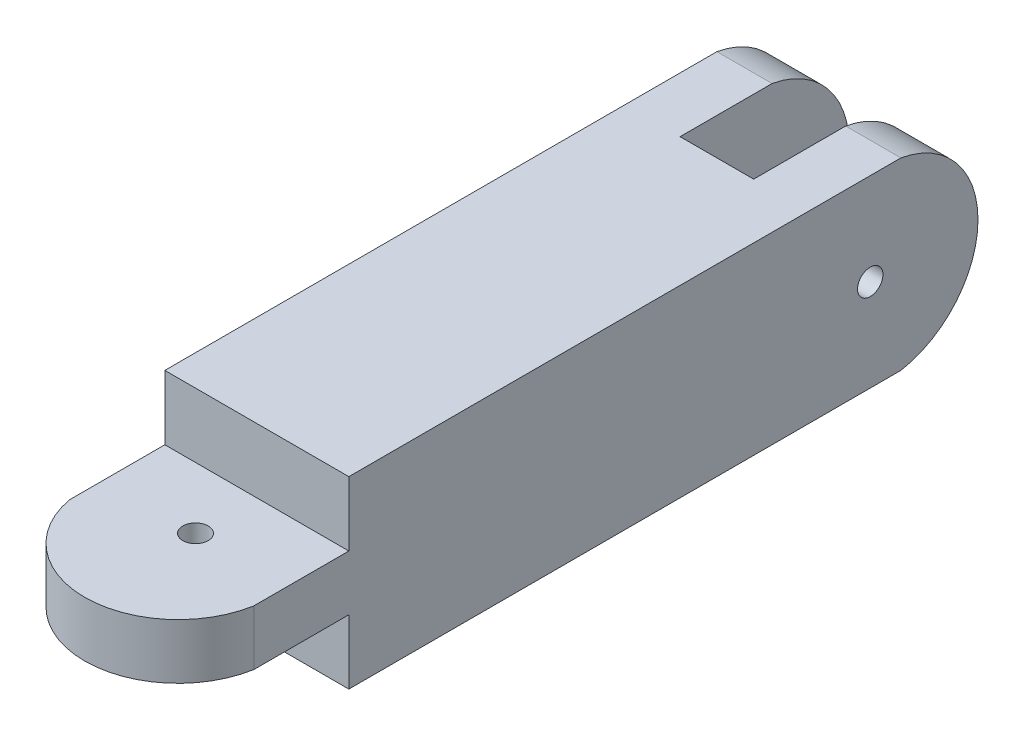
ISO-10303-21;
HEADER;
FILE_DESCRIPTION(('STEP AP214'),'2;1');
FILE_NAME('part.step','',(''),(''),'','','');
FILE_SCHEMA(('AUTOMOTIVE_DESIGN { 1 0 10303 214 1 1 1 1 }'));
ENDSEC;
DATA;
#1=APPLICATION_CONTEXT('core data for automotive mechanical design processes');
#2=APPLICATION_PROTOCOL_DEFINITION('international standard','automotive_design',2000,#1);
#3=PRODUCT_CONTEXT('',#1,'mechanical');
#4=PRODUCT('Part','Part','',(#3));
#5=PRODUCT_RELATED_PRODUCT_CATEGORY('part','',(#4));
#6=PRODUCT_DEFINITION_FORMATION('','',#4);
#7=PRODUCT_DEFINITION_CONTEXT('part definition',#1,'design');
#8=PRODUCT_DEFINITION('design','',#6,#7);
#9=PRODUCT_DEFINITION_SHAPE('','',#8);
#10=(LENGTH_UNIT() NAMED_UNIT(*) SI_UNIT(.MILLI.,.METRE.));
#11=(NAMED_UNIT(*) PLANE_ANGLE_UNIT() SI_UNIT($,.RADIAN.));
#12=(NAMED_UNIT(*) SI_UNIT($,.STERADIAN.) SOLID_ANGLE_UNIT());
#13=UNCERTAINTY_MEASURE_WITH_UNIT(LENGTH_MEASURE(1.E-05),#10,'distance_accuracy_value','');
#14=(GEOMETRIC_REPRESENTATION_CONTEXT(3) GLOBAL_UNCERTAINTY_ASSIGNED_CONTEXT((#13)) GLOBAL_UNIT_ASSIGNED_CONTEXT((#10,
#11,#12)) REPRESENTATION_CONTEXT('',''));
#15=CARTESIAN_POINT('',(0.,0.,0.));
#16=DIRECTION('',(0.,0.,1.));
#17=DIRECTION('',(1.,0.,0.));
#18=AXIS2_PLACEMENT_3D('',#15,#16,#17);
#19=CARTESIAN_POINT('',(0.,0.,150.));
#20=DIRECTION('',(0.,0.,1.));
#21=DIRECTION('',(1.,0.,0.));
#22=AXIS2_PLACEMENT_3D('',#19,#20,#21);
#23=PLANE('',#22);
#24=DIRECTION('',(1.,0.,0.));
#25=VECTOR('',#24,1.);
#26=CARTESIAN_POINT('',(-30.,-9.,150.));
#27=LINE('',#26,#25);
#28=CARTESIAN_POINT('',(-30.,-9.,150.));
#29=VERTEX_POINT('',#28);
#30=CARTESIAN_POINT('',(30.,-9.,150.));
#31=VERTEX_POINT('',#30);
#32=EDGE_CURVE('E55',#29,#31,#27,.T.);
#33=ORIENTED_EDGE('',*,*,#32,.F.);
#34=DIRECTION('',(0.,-1.,0.));
#35=VECTOR('',#34,1.);
#36=CARTESIAN_POINT('',(-30.,30.,150.));
#37=LINE('',#36,#35);
#38=CARTESIAN_POINT('',(-30.,-30.,150.));
#39=VERTEX_POINT('',#38);
#40=EDGE_CURVE('E309',#29,#39,#37,.T.);
#41=ORIENTED_EDGE('',*,*,#40,.T.);
#42=DIRECTION('',(1.,0.,0.));
#43=VECTOR('',#42,1.);
#44=CARTESIAN_POINT('',(-30.,-30.,150.));
#45=LINE('',#44,#43);
#46=CARTESIAN_POINT('',(30.,-30.,150.));
#47=VERTEX_POINT('',#46);
#48=EDGE_CURVE('E313',#39,#47,#45,.T.);
#49=ORIENTED_EDGE('',*,*,#48,.T.);
#50=DIRECTION('',(0.,1.,0.));
#51=VECTOR('',#50,1.);
#52=CARTESIAN_POINT('',(30.,30.,150.));
#53=LINE('',#52,#51);
#54=EDGE_CURVE('E302',#47,#31,#53,.T.);
#55=ORIENTED_EDGE('',*,*,#54,.T.);
#56=EDGE_LOOP('',(#33,#41,#49,#55));
#57=FACE_BOUND('',#56,.T.);
#58=ADVANCED_FACE('F39',(#57),#23,.T.);
#59=CARTESIAN_POINT('',(0.,0.,0.));
#60=DIRECTION('',(0.,0.,1.));
#61=DIRECTION('',(1.,0.,0.));
#62=AXIS2_PLACEMENT_3D('',#59,#60,#61);
#63=PLANE('',#62);
#64=DIRECTION('',(0.,1.,0.));
#65=VECTOR('',#64,1.);
#66=CARTESIAN_POINT('',(12.,30.,0.));
#67=LINE('',#66,#65);
#68=CARTESIAN_POINT('',(12.,-30.,0.));
#69=VERTEX_POINT('',#68);
#70=CARTESIAN_POINT('',(12.,30.,0.));
#71=VERTEX_POINT('',#70);
#72=EDGE_CURVE('E260',#69,#71,#67,.T.);
#73=ORIENTED_EDGE('',*,*,#72,.F.);
#74=DIRECTION('',(1.,0.,0.));
#75=VECTOR('',#74,1.);
#76=CARTESIAN_POINT('',(-30.,-30.,0.));
#77=LINE('',#76,#75);
#78=CARTESIAN_POINT('',(-12.,-30.,0.));
#79=VERTEX_POINT('',#78);
#80=EDGE_CURVE('E319',#79,#69,#77,.T.);
#81=ORIENTED_EDGE('',*,*,#80,.F.);
#82=DIRECTION('',(0.,-1.,0.));
#83=VECTOR('',#82,1.);
#84=CARTESIAN_POINT('',(-12.,-30.,0.));
#85=LINE('',#84,#83);
#86=CARTESIAN_POINT('',(-12.,30.,0.));
#87=VERTEX_POINT('',#86);
#88=EDGE_CURVE('E281',#87,#79,#85,.T.);
#89=ORIENTED_EDGE('',*,*,#88,.F.);
#90=DIRECTION('',(-1.,0.,0.));
#91=VECTOR('',#90,1.);
#92=CARTESIAN_POINT('',(-30.,30.,0.));
#93=LINE('',#92,#91);
#94=EDGE_CURVE('E301',#71,#87,#93,.T.);
#95=ORIENTED_EDGE('',*,*,#94,.F.);
#96=EDGE_LOOP('',(#73,#81,#89,#95));
#97=FACE_BOUND('',#96,.T.);
#98=ADVANCED_FACE('F374',(#97),#63,.F.);
#99=CARTESIAN_POINT('',(30.,30.,150.));
#100=DIRECTION('',(-1.,0.,0.));
#101=DIRECTION('',(0.,-1.,0.));
#102=AXIS2_PLACEMENT_3D('',#99,#100,#101);
#103=PLANE('',#102);
#104=CARTESIAN_POINT('',(30.,0.,-20.));
#105=DIRECTION('',(-1.,0.,0.));
#106=DIRECTION('',(0.,-1.,0.));
#107=AXIS2_PLACEMENT_3D('',#104,#105,#106);
#108=CIRCLE('',#107,4.15);
#109=CARTESIAN_POINT('',(30.,-4.15,-20.));
#110=VERTEX_POINT('',#109);
#111=EDGE_CURVE('E407',#110,#110,#108,.T.);
#112=ORIENTED_EDGE('',*,*,#111,.T.);
#113=EDGE_LOOP('',(#112));
#114=FACE_BOUND('',#113,.T.);
#115=DIRECTION('',(0.,0.,-1.));
#116=VECTOR('',#115,1.);
#117=CARTESIAN_POINT('',(30.,-30.,150.));
#118=LINE('',#117,#116);
#119=CARTESIAN_POINT('',(30.,-30.,-30.));
#120=VERTEX_POINT('',#119);
#121=EDGE_CURVE('E316',#47,#120,#118,.T.);
#122=ORIENTED_EDGE('',*,*,#121,.T.);
#123=CARTESIAN_POINT('',(30.,0.,-24.6688744152853));
#124=DIRECTION('',(1.,0.,0.));
#125=DIRECTION('',(0.,-1.,0.));
#126=AXIS2_PLACEMENT_3D('',#123,#124,#125);
#127=CIRCLE('',#126,30.47);
#128=CARTESIAN_POINT('',(30.,30.,-30.));
#129=VERTEX_POINT('',#128);
#130=EDGE_CURVE('E252',#120,#129,#127,.T.);
#131=ORIENTED_EDGE('',*,*,#130,.T.);
#132=DIRECTION('',(0.,0.,-1.));
#133=VECTOR('',#132,1.);
#134=CARTESIAN_POINT('',(30.,30.,150.));
#135=LINE('',#134,#133);
#136=CARTESIAN_POINT('',(30.,30.,150.));
#137=VERTEX_POINT('',#136);
#138=EDGE_CURVE('E11',#137,#129,#135,.T.);
#139=ORIENTED_EDGE('',*,*,#138,.F.);
#140=CARTESIAN_POINT('',(30.,9.,150.));
#141=VERTEX_POINT('',#140);
#142=EDGE_CURVE('E306',#141,#137,#53,.T.);
#143=ORIENTED_EDGE('',*,*,#142,.F.);
#144=DIRECTION('',(0.,0.,-1.));
#145=VECTOR('',#144,1.);
#146=CARTESIAN_POINT('',(30.,9.,181.));
#147=LINE('',#146,#145);
#148=CARTESIAN_POINT('',(30.,9.,181.));
#149=VERTEX_POINT('',#148);
#150=EDGE_CURVE('E243',#149,#141,#147,.T.);
#151=ORIENTED_EDGE('',*,*,#150,.F.);
#152=DIRECTION('',(0.,1.,0.));
#153=VECTOR('',#152,1.);
#154=CARTESIAN_POINT('',(30.,9.,181.));
#155=LINE('',#154,#153);
#156=CARTESIAN_POINT('',(30.,-9.,181.));
#157=VERTEX_POINT('',#156);
#158=EDGE_CURVE('E219',#157,#149,#155,.T.);
#159=ORIENTED_EDGE('',*,*,#158,.F.);
#160=DIRECTION('',(0.,0.,-1.));
#161=VECTOR('',#160,1.);
#162=CARTESIAN_POINT('',(30.,-9.,181.));
#163=LINE('',#162,#161);
#164=EDGE_CURVE('E227',#157,#31,#163,.T.);
#165=ORIENTED_EDGE('',*,*,#164,.T.);
#166=ORIENTED_EDGE('',*,*,#54,.F.);
#167=EDGE_LOOP('',(#122,#131,#139,#143,#151,#159,#165,#166));
#168=FACE_BOUND('',#167,.T.);
#169=ADVANCED_FACE('F41',(#114,#168),#103,.F.);
#170=CARTESIAN_POINT('',(-30.,30.,150.));
#171=DIRECTION('',(0.,-1.,0.));
#172=DIRECTION('',(0.,0.,-1.));
#173=AXIS2_PLACEMENT_3D('',#170,#171,#172);
#174=PLANE('',#173);
#175=ORIENTED_EDGE('',*,*,#138,.T.);
#176=DIRECTION('',(1.,0.,0.));
#177=VECTOR('',#176,1.);
#178=CARTESIAN_POINT('',(30.,30.,-30.));
#179=LINE('',#178,#177);
#180=CARTESIAN_POINT('',(12.,30.,-30.));
#181=VERTEX_POINT('',#180);
#182=EDGE_CURVE('E268',#181,#129,#179,.T.);
#183=ORIENTED_EDGE('',*,*,#182,.F.);
#184=DIRECTION('',(0.,0.,1.));
#185=VECTOR('',#184,1.);
#186=CARTESIAN_POINT('',(12.,30.,-30.));
#187=LINE('',#186,#185);
#188=EDGE_CURVE('E272',#181,#71,#187,.T.);
#189=ORIENTED_EDGE('',*,*,#188,.T.);
#190=ORIENTED_EDGE('',*,*,#94,.T.);
#191=DIRECTION('',(0.,0.,1.));
#192=VECTOR('',#191,1.);
#193=CARTESIAN_POINT('',(-12.,30.,-30.));
#194=LINE('',#193,#192);
#195=CARTESIAN_POINT('',(-12.,30.,-30.));
#196=VERTEX_POINT('',#195);
#197=EDGE_CURVE('E297',#196,#87,#194,.T.);
#198=ORIENTED_EDGE('',*,*,#197,.F.);
#199=DIRECTION('',(1.,0.,0.));
#200=VECTOR('',#199,1.);
#201=CARTESIAN_POINT('',(-30.,30.,-30.));
#202=LINE('',#201,#200);
#203=CARTESIAN_POINT('',(-30.,30.,-30.));
#204=VERTEX_POINT('',#203);
#205=EDGE_CURVE('E282',#204,#196,#202,.T.);
#206=ORIENTED_EDGE('',*,*,#205,.F.);
#207=DIRECTION('',(0.,0.,-1.));
#208=VECTOR('',#207,1.);
#209=CARTESIAN_POINT('',(-30.,30.,150.));
#210=LINE('',#209,#208);
#211=CARTESIAN_POINT('',(-30.,30.,150.));
#212=VERTEX_POINT('',#211);
#213=EDGE_CURVE('E48',#212,#204,#210,.T.);
#214=ORIENTED_EDGE('',*,*,#213,.F.);
#215=DIRECTION('',(-1.,0.,0.));
#216=VECTOR('',#215,1.);
#217=CARTESIAN_POINT('',(-30.,30.,150.));
#218=LINE('',#217,#216);
#219=EDGE_CURVE('E305',#137,#212,#218,.T.);
#220=ORIENTED_EDGE('',*,*,#219,.F.);
#221=EDGE_LOOP('',(#175,#183,#189,#190,#198,#206,#214,#220));
#222=FACE_BOUND('',#221,.T.);
#223=ADVANCED_FACE('F361',(#222),#174,.F.);
#224=CARTESIAN_POINT('',(-30.,30.,150.));
#225=DIRECTION('',(1.,0.,0.));
#226=DIRECTION('',(0.,1.,0.));
#227=AXIS2_PLACEMENT_3D('',#224,#225,#226);
#228=PLANE('',#227);
#229=CARTESIAN_POINT('',(-30.,0.,-20.));
#230=DIRECTION('',(1.,0.,0.));
#231=DIRECTION('',(0.,1.,0.));
#232=AXIS2_PLACEMENT_3D('',#229,#230,#231);
#233=CIRCLE('',#232,4.15);
#234=CARTESIAN_POINT('',(-30.,4.15,-20.));
#235=VERTEX_POINT('',#234);
#236=EDGE_CURVE('E416',#235,#235,#233,.T.);
#237=ORIENTED_EDGE('',*,*,#236,.T.);
#238=EDGE_LOOP('',(#237));
#239=FACE_BOUND('',#238,.T.);
#240=ORIENTED_EDGE('',*,*,#213,.T.);
#241=CARTESIAN_POINT('',(-30.,0.,-24.6688744152853));
#242=DIRECTION('',(-1.,0.,0.));
#243=DIRECTION('',(0.,1.,0.));
#244=AXIS2_PLACEMENT_3D('',#241,#242,#243);
#245=CIRCLE('',#244,30.47);
#246=CARTESIAN_POINT('',(-30.,-30.,-30.));
#247=VERTEX_POINT('',#246);
#248=EDGE_CURVE('E247',#204,#247,#245,.T.);
#249=ORIENTED_EDGE('',*,*,#248,.T.);
#250=DIRECTION('',(0.,0.,-1.));
#251=VECTOR('',#250,1.);
#252=CARTESIAN_POINT('',(-30.,-30.,150.));
#253=LINE('',#252,#251);
#254=EDGE_CURVE('E326',#39,#247,#253,.T.);
#255=ORIENTED_EDGE('',*,*,#254,.F.);
#256=ORIENTED_EDGE('',*,*,#40,.F.);
#257=DIRECTION('',(0.,0.,-1.));
#258=VECTOR('',#257,1.);
#259=CARTESIAN_POINT('',(-30.,-9.,181.));
#260=LINE('',#259,#258);
#261=CARTESIAN_POINT('',(-30.,-9.,181.));
#262=VERTEX_POINT('',#261);
#263=EDGE_CURVE('E235',#262,#29,#260,.T.);
#264=ORIENTED_EDGE('',*,*,#263,.F.);
#265=DIRECTION('',(0.,-1.,0.));
#266=VECTOR('',#265,1.);
#267=CARTESIAN_POINT('',(-30.,9.,181.));
#268=LINE('',#267,#266);
#269=CARTESIAN_POINT('',(-30.,9.,181.));
#270=VERTEX_POINT('',#269);
#271=EDGE_CURVE('E223',#270,#262,#268,.T.);
#272=ORIENTED_EDGE('',*,*,#271,.F.);
#273=DIRECTION('',(0.,0.,-1.));
#274=VECTOR('',#273,1.);
#275=CARTESIAN_POINT('',(-30.,9.,181.));
#276=LINE('',#275,#274);
#277=CARTESIAN_POINT('',(-30.,9.,150.));
#278=VERTEX_POINT('',#277);
#279=EDGE_CURVE('E239',#270,#278,#276,.T.);
#280=ORIENTED_EDGE('',*,*,#279,.T.);
#281=EDGE_CURVE('E310',#212,#278,#37,.T.);
#282=ORIENTED_EDGE('',*,*,#281,.F.);
#283=EDGE_LOOP('',(#240,#249,#255,#256,#264,#272,#280,#282));
#284=FACE_BOUND('',#283,.T.);
#285=ADVANCED_FACE('F334',(#239,#284),#228,.F.);
#286=CARTESIAN_POINT('',(-30.,-30.,150.));
#287=DIRECTION('',(0.,1.,0.));
#288=DIRECTION('',(0.,0.,1.));
#289=AXIS2_PLACEMENT_3D('',#286,#287,#288);
#290=PLANE('',#289);
#291=ORIENTED_EDGE('',*,*,#254,.T.);
#292=DIRECTION('',(-1.,0.,0.));
#293=VECTOR('',#292,1.);
#294=CARTESIAN_POINT('',(-30.,-30.,-30.));
#295=LINE('',#294,#293);
#296=CARTESIAN_POINT('',(-12.,-30.,-30.));
#297=VERTEX_POINT('',#296);
#298=EDGE_CURVE('E286',#297,#247,#295,.T.);
#299=ORIENTED_EDGE('',*,*,#298,.F.);
#300=DIRECTION('',(0.,0.,1.));
#301=VECTOR('',#300,1.);
#302=CARTESIAN_POINT('',(-12.,-30.,-30.));
#303=LINE('',#302,#301);
#304=EDGE_CURVE('E290',#297,#79,#303,.T.);
#305=ORIENTED_EDGE('',*,*,#304,.T.);
#306=ORIENTED_EDGE('',*,*,#80,.T.);
#307=DIRECTION('',(0.,0.,1.));
#308=VECTOR('',#307,1.);
#309=CARTESIAN_POINT('',(12.,-30.,-30.));
#310=LINE('',#309,#308);
#311=CARTESIAN_POINT('',(12.,-30.,-30.));
#312=VERTEX_POINT('',#311);
#313=EDGE_CURVE('E278',#312,#69,#310,.T.);
#314=ORIENTED_EDGE('',*,*,#313,.F.);
#315=DIRECTION('',(-1.,0.,0.));
#316=VECTOR('',#315,1.);
#317=CARTESIAN_POINT('',(30.,-30.,-30.));
#318=LINE('',#317,#316);
#319=EDGE_CURVE('E264',#120,#312,#318,.T.);
#320=ORIENTED_EDGE('',*,*,#319,.F.);
#321=ORIENTED_EDGE('',*,*,#121,.F.);
#322=ORIENTED_EDGE('',*,*,#48,.F.);
#323=EDGE_LOOP('',(#291,#299,#305,#306,#314,#320,#321,#322));
#324=FACE_BOUND('',#323,.T.);
#325=ADVANCED_FACE('F343',(#324),#290,.F.);
#326=DIRECTION('',(-1.,0.,0.));
#327=VECTOR('',#326,1.);
#328=CARTESIAN_POINT('',(-30.,9.,150.));
#329=LINE('',#328,#327);
#330=EDGE_CURVE('E63',#141,#278,#329,.T.);
#331=ORIENTED_EDGE('',*,*,#330,.F.);
#332=ORIENTED_EDGE('',*,*,#142,.T.);
#333=ORIENTED_EDGE('',*,*,#219,.T.);
#334=ORIENTED_EDGE('',*,*,#281,.T.);
#335=EDGE_LOOP('',(#331,#332,#333,#334));
#336=FACE_BOUND('',#335,.T.);
#337=ADVANCED_FACE('F360',(#336),#23,.T.);
#338=CARTESIAN_POINT('',(-12.,-30.,-30.));
#339=DIRECTION('',(-1.,0.,0.));
#340=DIRECTION('',(0.,-1.,0.));
#341=AXIS2_PLACEMENT_3D('',#338,#339,#340);
#342=PLANE('',#341);
#343=CARTESIAN_POINT('',(-12.,0.,-20.));
#344=DIRECTION('',(1.,0.,0.));
#345=DIRECTION('',(0.,1.,0.));
#346=AXIS2_PLACEMENT_3D('',#343,#344,#345);
#347=CIRCLE('',#346,4.15);
#348=CARTESIAN_POINT('',(-12.,4.15,-20.));
#349=VERTEX_POINT('',#348);
#350=EDGE_CURVE('E419',#349,#349,#347,.T.);
#351=ORIENTED_EDGE('',*,*,#350,.F.);
#352=EDGE_LOOP('',(#351));
#353=FACE_BOUND('',#352,.T.);
#354=ORIENTED_EDGE('',*,*,#88,.T.);
#355=ORIENTED_EDGE('',*,*,#304,.F.);
#356=CARTESIAN_POINT('',(-12.,0.,-24.6688744152853));
#357=DIRECTION('',(-1.,0.,0.));
#358=DIRECTION('',(0.,1.,0.));
#359=AXIS2_PLACEMENT_3D('',#356,#357,#358);
#360=CIRCLE('',#359,30.47);
#361=EDGE_CURVE('E248',#196,#297,#360,.T.);
#362=ORIENTED_EDGE('',*,*,#361,.F.);
#363=ORIENTED_EDGE('',*,*,#197,.T.);
#364=EDGE_LOOP('',(#354,#355,#362,#363));
#365=FACE_BOUND('',#364,.T.);
#366=ADVANCED_FACE('F376',(#353,#365),#342,.F.);
#367=CARTESIAN_POINT('',(12.,30.,-30.));
#368=DIRECTION('',(1.,0.,0.));
#369=DIRECTION('',(0.,1.,0.));
#370=AXIS2_PLACEMENT_3D('',#367,#368,#369);
#371=PLANE('',#370);
#372=CARTESIAN_POINT('',(12.,0.,-20.));
#373=DIRECTION('',(-1.,0.,0.));
#374=DIRECTION('',(0.,-1.,0.));
#375=AXIS2_PLACEMENT_3D('',#372,#373,#374);
#376=CIRCLE('',#375,4.15);
#377=CARTESIAN_POINT('',(12.,-4.15,-20.));
#378=VERTEX_POINT('',#377);
#379=EDGE_CURVE('E410',#378,#378,#376,.T.);
#380=ORIENTED_EDGE('',*,*,#379,.F.);
#381=EDGE_LOOP('',(#380));
#382=FACE_BOUND('',#381,.T.);
#383=ORIENTED_EDGE('',*,*,#72,.T.);
#384=ORIENTED_EDGE('',*,*,#188,.F.);
#385=CARTESIAN_POINT('',(12.,0.,-24.6688744152853));
#386=DIRECTION('',(1.,0.,0.));
#387=DIRECTION('',(0.,-1.,0.));
#388=AXIS2_PLACEMENT_3D('',#385,#386,#387);
#389=CIRCLE('',#388,30.47);
#390=EDGE_CURVE('E256',#312,#181,#389,.T.);
#391=ORIENTED_EDGE('',*,*,#390,.F.);
#392=ORIENTED_EDGE('',*,*,#313,.T.);
#393=EDGE_LOOP('',(#383,#384,#391,#392));
#394=FACE_BOUND('',#393,.T.);
#395=ADVANCED_FACE('F369',(#382,#394),#371,.F.);
#396=CARTESIAN_POINT('',(12.,0.,-24.6688744152853));
#397=DIRECTION('',(1.,0.,0.));
#398=DIRECTION('',(0.,1.,0.));
#399=AXIS2_PLACEMENT_3D('',#396,#397,#398);
#400=CYLINDRICAL_SURFACE('',#399,30.47);
#401=ORIENTED_EDGE('',*,*,#130,.F.);
#402=ORIENTED_EDGE('',*,*,#319,.T.);
#403=ORIENTED_EDGE('',*,*,#390,.T.);
#404=ORIENTED_EDGE('',*,*,#182,.T.);
#405=EDGE_LOOP('',(#401,#402,#403,#404));
#406=FACE_BOUND('',#405,.T.);
#407=ADVANCED_FACE('F365',(#406),#400,.T.);
#408=CARTESIAN_POINT('',(-12.,0.,-24.6688744152853));
#409=DIRECTION('',(-1.,0.,0.));
#410=DIRECTION('',(0.,-1.,0.));
#411=AXIS2_PLACEMENT_3D('',#408,#409,#410);
#412=CYLINDRICAL_SURFACE('',#411,30.47);
#413=ORIENTED_EDGE('',*,*,#248,.F.);
#414=ORIENTED_EDGE('',*,*,#205,.T.);
#415=ORIENTED_EDGE('',*,*,#361,.T.);
#416=ORIENTED_EDGE('',*,*,#298,.T.);
#417=EDGE_LOOP('',(#413,#414,#415,#416));
#418=FACE_BOUND('',#417,.T.);
#419=ADVANCED_FACE('F339',(#418),#412,.T.);
#420=CARTESIAN_POINT('',(-30.,9.,181.));
#421=DIRECTION('',(0.,-1.,0.));
#422=DIRECTION('',(0.,0.,-1.));
#423=AXIS2_PLACEMENT_3D('',#420,#421,#422);
#424=PLANE('',#423);
#425=CARTESIAN_POINT('',(0.,8.99999999999999,170.));
#426=DIRECTION('',(0.,-1.,0.));
#427=DIRECTION('',(0.,0.,-1.));
#428=AXIS2_PLACEMENT_3D('',#425,#426,#427);
#429=CIRCLE('',#428,4.14999999999999);
#430=CARTESIAN_POINT('',(0.,8.99999999999999,165.85));
#431=VERTEX_POINT('',#430);
#432=EDGE_CURVE('E181',#431,#431,#429,.T.);
#433=ORIENTED_EDGE('',*,*,#432,.T.);
#434=EDGE_LOOP('',(#433));
#435=FACE_BOUND('',#434,.T.);
#436=ORIENTED_EDGE('',*,*,#330,.T.);
#437=ORIENTED_EDGE('',*,*,#279,.F.);
#438=CARTESIAN_POINT('',(0.,9.,175.668874415285));
#439=DIRECTION('',(0.,1.,0.));
#440=DIRECTION('',(0.,0.,-1.));
#441=AXIS2_PLACEMENT_3D('',#438,#439,#440);
#442=CIRCLE('',#441,30.47);
#443=EDGE_CURVE('E206',#270,#149,#442,.T.);
#444=ORIENTED_EDGE('',*,*,#443,.T.);
#445=ORIENTED_EDGE('',*,*,#150,.T.);
#446=EDGE_LOOP('',(#436,#437,#444,#445));
#447=FACE_BOUND('',#446,.T.);
#448=ADVANCED_FACE('F356',(#435,#447),#424,.F.);
#449=CARTESIAN_POINT('',(-30.,-9.,181.));
#450=DIRECTION('',(0.,1.,0.));
#451=DIRECTION('',(0.,0.,1.));
#452=AXIS2_PLACEMENT_3D('',#449,#450,#451);
#453=PLANE('',#452);
#454=CARTESIAN_POINT('',(0.,-9.,170.));
#455=DIRECTION('',(0.,-1.,0.));
#456=DIRECTION('',(0.,0.,-1.));
#457=AXIS2_PLACEMENT_3D('',#454,#455,#456);
#458=CIRCLE('',#457,4.14999999999999);
#459=CARTESIAN_POINT('',(0.,-9.,165.85));
#460=VERTEX_POINT('',#459);
#461=EDGE_CURVE('E185',#460,#460,#458,.T.);
#462=ORIENTED_EDGE('',*,*,#461,.F.);
#463=EDGE_LOOP('',(#462));
#464=FACE_BOUND('',#463,.T.);
#465=ORIENTED_EDGE('',*,*,#32,.T.);
#466=ORIENTED_EDGE('',*,*,#164,.F.);
#467=CARTESIAN_POINT('',(0.,-9.,175.668874415285));
#468=DIRECTION('',(0.,1.,0.));
#469=DIRECTION('',(0.,0.,-1.));
#470=AXIS2_PLACEMENT_3D('',#467,#468,#469);
#471=CIRCLE('',#470,30.47);
#472=EDGE_CURVE('E212',#262,#157,#471,.T.);
#473=ORIENTED_EDGE('',*,*,#472,.F.);
#474=ORIENTED_EDGE('',*,*,#263,.T.);
#475=EDGE_LOOP('',(#465,#466,#473,#474));
#476=FACE_BOUND('',#475,.T.);
#477=ADVANCED_FACE('F349',(#464,#476),#453,.F.);
#478=CARTESIAN_POINT('',(0.,-9.,175.668874415285));
#479=DIRECTION('',(0.,1.,0.));
#480=DIRECTION('',(0.,0.,1.));
#481=AXIS2_PLACEMENT_3D('',#478,#479,#480);
#482=CYLINDRICAL_SURFACE('',#481,30.47);
#483=ORIENTED_EDGE('',*,*,#443,.F.);
#484=ORIENTED_EDGE('',*,*,#271,.T.);
#485=ORIENTED_EDGE('',*,*,#472,.T.);
#486=ORIENTED_EDGE('',*,*,#158,.T.);
#487=EDGE_LOOP('',(#483,#484,#485,#486));
#488=FACE_BOUND('',#487,.T.);
#489=ADVANCED_FACE('F353',(#488),#482,.T.);
#490=CARTESIAN_POINT('',(0.,121.,170.));
#491=DIRECTION('',(0.,-1.,0.));
#492=DIRECTION('',(0.,0.,-1.));
#493=AXIS2_PLACEMENT_3D('',#490,#491,#492);
#494=CYLINDRICAL_SURFACE('',#493,4.14999999999999);
#495=ORIENTED_EDGE('',*,*,#461,.T.);
#496=EDGE_LOOP('',(#495));
#497=FACE_BOUND('',#496,.T.);
#498=ORIENTED_EDGE('',*,*,#432,.F.);
#499=EDGE_LOOP('',(#498));
#500=FACE_BOUND('',#499,.T.);
#501=ADVANCED_FACE('F436',(#497,#500),#494,.F.);
#502=CARTESIAN_POINT('',(30.,0.,-20.));
#503=DIRECTION('',(-1.,0.,0.));
#504=DIRECTION('',(0.,-1.,0.));
#505=AXIS2_PLACEMENT_3D('',#502,#503,#504);
#506=CYLINDRICAL_SURFACE('',#505,4.15);
#507=ORIENTED_EDGE('',*,*,#111,.F.);
#508=EDGE_LOOP('',(#507));
#509=FACE_BOUND('',#508,.T.);
#510=ORIENTED_EDGE('',*,*,#379,.T.);
#511=EDGE_LOOP('',(#510));
#512=FACE_BOUND('',#511,.T.);
#513=ADVANCED_FACE('F430',(#509,#512),#506,.F.);
#514=CARTESIAN_POINT('',(-30.,0.,-20.));
#515=DIRECTION('',(1.,0.,0.));
#516=DIRECTION('',(0.,1.,0.));
#517=AXIS2_PLACEMENT_3D('',#514,#515,#516);
#518=CYLINDRICAL_SURFACE('',#517,4.15);
#519=ORIENTED_EDGE('',*,*,#236,.F.);
#520=EDGE_LOOP('',(#519));
#521=FACE_BOUND('',#520,.T.);
#522=ORIENTED_EDGE('',*,*,#350,.T.);
#523=EDGE_LOOP('',(#522));
#524=FACE_BOUND('',#523,.T.);
#525=ADVANCED_FACE('F427',(#521,#524),#518,.F.);
#526=CLOSED_SHELL('',(#58,#98,#169,#223,#285,#325,#337,#366,#395,#407,#419,#448,#477,#489,#501,
#513,#525));
#527=CARTESIAN_POINT('',(-25.25,-25.25,145.));
#528=DIRECTION('',(-1.,0.,0.));
#529=DIRECTION('',(0.,0.,1.));
#530=AXIS2_PLACEMENT_3D('',#527,#528,#529);
#531=PLANE('',#530);
#532=DIRECTION('',(0.,0.,-1.));
#533=VECTOR('',#532,1.);
#534=CARTESIAN_POINT('',(-25.25,25.25,145.));
#535=LINE('',#534,#533);
#536=CARTESIAN_POINT('',(-25.25,25.25,145.));
#537=VERTEX_POINT('',#536);
#538=CARTESIAN_POINT('',(-25.25,25.25,9.9999999999999));
#539=VERTEX_POINT('',#538);
#540=EDGE_CURVE('E152',#537,#539,#535,.T.);
#541=ORIENTED_EDGE('',*,*,#540,.F.);
#542=DIRECTION('',(0.,1.,0.));
#543=VECTOR('',#542,1.);
#544=CARTESIAN_POINT('',(-25.25,-25.25,145.));
#545=LINE('',#544,#543);
#546=CARTESIAN_POINT('',(-25.25,-25.25,145.));
#547=VERTEX_POINT('',#546);
#548=EDGE_CURVE('E194',#547,#537,#545,.T.);
#549=ORIENTED_EDGE('',*,*,#548,.F.);
#550=DIRECTION('',(0.,0.,-1.));
#551=VECTOR('',#550,1.);
#552=CARTESIAN_POINT('',(-25.25,-25.25,145.));
#553=LINE('',#552,#551);
#554=CARTESIAN_POINT('',(-25.25,-25.25,9.9999999999999));
#555=VERTEX_POINT('',#554);
#556=EDGE_CURVE('E179',#547,#555,#553,.T.);
#557=ORIENTED_EDGE('',*,*,#556,.T.);
#558=DIRECTION('',(0.,1.,0.));
#559=VECTOR('',#558,1.);
#560=CARTESIAN_POINT('',(-25.25,-25.25,9.9999999999999));
#561=LINE('',#560,#559);
#562=EDGE_CURVE('E172',#555,#539,#561,.T.);
#563=ORIENTED_EDGE('',*,*,#562,.T.);
#564=EDGE_LOOP('',(#541,#549,#557,#563));
#565=FACE_BOUND('',#564,.T.);
#566=ADVANCED_FACE('F178',(#565),#531,.F.);
#567=CARTESIAN_POINT('',(-25.25,-25.25,145.));
#568=DIRECTION('',(0.,1.,0.));
#569=DIRECTION('',(0.,0.,1.));
#570=AXIS2_PLACEMENT_3D('',#567,#568,#569);
#571=PLANE('',#570);
#572=ORIENTED_EDGE('',*,*,#556,.F.);
#573=DIRECTION('',(1.,0.,0.));
#574=VECTOR('',#573,1.);
#575=CARTESIAN_POINT('',(-25.25,-25.25,145.));
#576=LINE('',#575,#574);
#577=CARTESIAN_POINT('',(25.25,-25.25,145.));
#578=VERTEX_POINT('',#577);
#579=EDGE_CURVE('E166',#547,#578,#576,.T.);
#580=ORIENTED_EDGE('',*,*,#579,.T.);
#581=DIRECTION('',(0.,0.,-1.));
#582=VECTOR('',#581,1.);
#583=CARTESIAN_POINT('',(25.25,-25.25,145.));
#584=LINE('',#583,#582);
#585=CARTESIAN_POINT('',(25.25,-25.25,9.9999999999999));
#586=VERTEX_POINT('',#585);
#587=EDGE_CURVE('E207',#578,#586,#584,.T.);
#588=ORIENTED_EDGE('',*,*,#587,.T.);
#589=DIRECTION('',(1.,0.,0.));
#590=VECTOR('',#589,1.);
#591=CARTESIAN_POINT('',(-25.25,-25.25,9.9999999999999));
#592=LINE('',#591,#590);
#593=EDGE_CURVE('E191',#555,#586,#592,.T.);
#594=ORIENTED_EDGE('',*,*,#593,.F.);
#595=EDGE_LOOP('',(#572,#580,#588,#594));
#596=FACE_BOUND('',#595,.T.);
#597=ADVANCED_FACE('F449',(#596),#571,.T.);
#598=CARTESIAN_POINT('',(25.25,-25.25,145.));
#599=DIRECTION('',(-1.,0.,0.));
#600=DIRECTION('',(0.,0.,1.));
#601=AXIS2_PLACEMENT_3D('',#598,#599,#600);
#602=PLANE('',#601);
#603=ORIENTED_EDGE('',*,*,#587,.F.);
#604=DIRECTION('',(0.,1.,0.));
#605=VECTOR('',#604,1.);
#606=CARTESIAN_POINT('',(25.25,-25.25,145.));
#607=LINE('',#606,#605);
#608=CARTESIAN_POINT('',(25.25,25.25,145.));
#609=VERTEX_POINT('',#608);
#610=EDGE_CURVE('E199',#578,#609,#607,.T.);
#611=ORIENTED_EDGE('',*,*,#610,.T.);
#612=DIRECTION('',(0.,0.,-1.));
#613=VECTOR('',#612,1.);
#614=CARTESIAN_POINT('',(25.25,25.25,145.));
#615=LINE('',#614,#613);
#616=CARTESIAN_POINT('',(25.25,25.25,9.9999999999999));
#617=VERTEX_POINT('',#616);
#618=EDGE_CURVE('E165',#609,#617,#615,.T.);
#619=ORIENTED_EDGE('',*,*,#618,.T.);
#620=DIRECTION('',(0.,1.,0.));
#621=VECTOR('',#620,1.);
#622=CARTESIAN_POINT('',(25.25,-25.25,9.9999999999999));
#623=LINE('',#622,#621);
#624=EDGE_CURVE('E175',#586,#617,#623,.T.);
#625=ORIENTED_EDGE('',*,*,#624,.F.);
#626=EDGE_LOOP('',(#603,#611,#619,#625));
#627=FACE_BOUND('',#626,.T.);
#628=ADVANCED_FACE('F452',(#627),#602,.T.);
#629=CARTESIAN_POINT('',(-25.25,25.25,145.));
#630=DIRECTION('',(0.,1.,0.));
#631=DIRECTION('',(0.,0.,1.));
#632=AXIS2_PLACEMENT_3D('',#629,#630,#631);
#633=PLANE('',#632);
#634=ORIENTED_EDGE('',*,*,#618,.F.);
#635=DIRECTION('',(1.,0.,0.));
#636=VECTOR('',#635,1.);
#637=CARTESIAN_POINT('',(-25.25,25.25,145.));
#638=LINE('',#637,#636);
#639=EDGE_CURVE('E159',#537,#609,#638,.T.);
#640=ORIENTED_EDGE('',*,*,#639,.F.);
#641=ORIENTED_EDGE('',*,*,#540,.T.);
#642=DIRECTION('',(1.,0.,0.));
#643=VECTOR('',#642,1.);
#644=CARTESIAN_POINT('',(-25.25,25.25,9.9999999999999));
#645=LINE('',#644,#643);
#646=EDGE_CURVE('E156',#539,#617,#645,.T.);
#647=ORIENTED_EDGE('',*,*,#646,.T.);
#648=EDGE_LOOP('',(#634,#640,#641,#647));
#649=FACE_BOUND('',#648,.T.);
#650=ADVANCED_FACE('F155',(#649),#633,.F.);
#651=CARTESIAN_POINT('',(0.,0.,145.));
#652=DIRECTION('',(0.,0.,-1.));
#653=DIRECTION('',(-1.,0.,0.));
#654=AXIS2_PLACEMENT_3D('',#651,#652,#653);
#655=PLANE('',#654);
#656=ORIENTED_EDGE('',*,*,#548,.T.);
#657=ORIENTED_EDGE('',*,*,#639,.T.);
#658=ORIENTED_EDGE('',*,*,#610,.F.);
#659=ORIENTED_EDGE('',*,*,#579,.F.);
#660=EDGE_LOOP('',(#656,#657,#658,#659));
#661=FACE_BOUND('',#660,.T.);
#662=ADVANCED_FACE('F444',(#661),#655,.T.);
#663=CARTESIAN_POINT('',(0.,0.,9.9999999999999));
#664=DIRECTION('',(0.,0.,-1.));
#665=DIRECTION('',(-1.,0.,0.));
#666=AXIS2_PLACEMENT_3D('',#663,#664,#665);
#667=PLANE('',#666);
#668=ORIENTED_EDGE('',*,*,#562,.F.);
#669=ORIENTED_EDGE('',*,*,#593,.T.);
#670=ORIENTED_EDGE('',*,*,#624,.T.);
#671=ORIENTED_EDGE('',*,*,#646,.F.);
#672=EDGE_LOOP('',(#668,#669,#670,#671));
#673=FACE_BOUND('',#672,.T.);
#674=ADVANCED_FACE('F170',(#673),#667,.F.);
#675=CLOSED_SHELL('',(#566,#597,#628,#650,#662,#674));
#676=ORIENTED_CLOSED_SHELL('',*,#675,.T.);
#677=BREP_WITH_VOIDS('B2',#526,(#676));
#678=ADVANCED_BREP_SHAPE_REPRESENTATION('',(#18,#677),#14);
#679=SHAPE_DEFINITION_REPRESENTATION(#9,#678);
ENDSEC;
END-ISO-10303-21;
